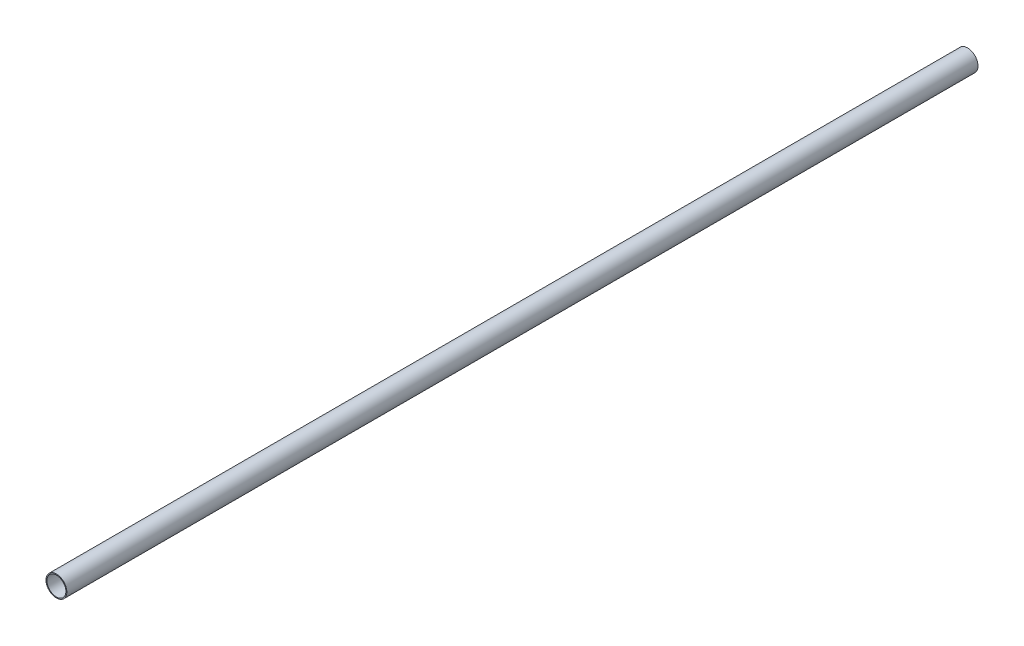
ISO-10303-21;
HEADER;
FILE_DESCRIPTION(('STEP AP214'),'2;1');
FILE_NAME('part.step','',(''),(''),'','','');
FILE_SCHEMA(('AUTOMOTIVE_DESIGN { 1 0 10303 214 1 1 1 1 }'));
ENDSEC;
DATA;
#1=APPLICATION_CONTEXT('core data for automotive mechanical design processes');
#2=APPLICATION_PROTOCOL_DEFINITION('international standard','automotive_design',2000,#1);
#3=PRODUCT_CONTEXT('',#1,'mechanical');
#4=PRODUCT('Part','Part','',(#3));
#5=PRODUCT_RELATED_PRODUCT_CATEGORY('part','',(#4));
#6=PRODUCT_DEFINITION_FORMATION('','',#4);
#7=PRODUCT_DEFINITION_CONTEXT('part definition',#1,'design');
#8=PRODUCT_DEFINITION('design','',#6,#7);
#9=PRODUCT_DEFINITION_SHAPE('','',#8);
#10=(LENGTH_UNIT() NAMED_UNIT(*) SI_UNIT(.MILLI.,.METRE.));
#11=(NAMED_UNIT(*) PLANE_ANGLE_UNIT() SI_UNIT($,.RADIAN.));
#12=(NAMED_UNIT(*) SI_UNIT($,.STERADIAN.) SOLID_ANGLE_UNIT());
#13=UNCERTAINTY_MEASURE_WITH_UNIT(LENGTH_MEASURE(1.E-05),#10,'distance_accuracy_value','');
#14=(GEOMETRIC_REPRESENTATION_CONTEXT(3) GLOBAL_UNCERTAINTY_ASSIGNED_CONTEXT((#13)) GLOBAL_UNIT_ASSIGNED_CONTEXT((#10,
#11,#12)) REPRESENTATION_CONTEXT('',''));
#15=CARTESIAN_POINT('',(0.,0.,0.));
#16=DIRECTION('',(0.,0.,1.));
#17=DIRECTION('',(1.,0.,0.));
#18=AXIS2_PLACEMENT_3D('',#15,#16,#17);
#19=CARTESIAN_POINT('',(0.,0.,961.));
#20=DIRECTION('',(0.,0.,1.));
#21=DIRECTION('',(1.,0.,0.));
#22=AXIS2_PLACEMENT_3D('',#19,#20,#21);
#23=PLANE('',#22);
#24=CARTESIAN_POINT('',(0.,0.,961.));
#25=DIRECTION('',(0.,0.,1.));
#26=DIRECTION('',(1.,0.,0.));
#27=AXIS2_PLACEMENT_3D('',#24,#25,#26);
#28=CIRCLE('',#27,11.);
#29=CARTESIAN_POINT('',(11.,0.,961.));
#30=VERTEX_POINT('',#29);
#31=EDGE_CURVE('E10',#30,#30,#28,.T.);
#32=ORIENTED_EDGE('',*,*,#31,.T.);
#33=EDGE_LOOP('',(#32));
#34=FACE_BOUND('',#33,.T.);
#35=CARTESIAN_POINT('',(0.,0.,961.));
#36=DIRECTION('',(0.,0.,1.));
#37=DIRECTION('',(1.,0.,0.));
#38=AXIS2_PLACEMENT_3D('',#35,#36,#37);
#39=CIRCLE('',#38,10.);
#40=CARTESIAN_POINT('',(10.,0.,961.));
#41=VERTEX_POINT('',#40);
#42=EDGE_CURVE('E50',#41,#41,#39,.T.);
#43=ORIENTED_EDGE('',*,*,#42,.F.);
#44=EDGE_LOOP('',(#43));
#45=FACE_BOUND('',#44,.T.);
#46=ADVANCED_FACE('F39',(#34,#45),#23,.T.);
#47=CARTESIAN_POINT('',(0.,0.,0.));
#48=DIRECTION('',(0.,0.,1.));
#49=DIRECTION('',(1.,0.,0.));
#50=AXIS2_PLACEMENT_3D('',#47,#48,#49);
#51=PLANE('',#50);
#52=CARTESIAN_POINT('',(0.,0.,0.));
#53=DIRECTION('',(0.,0.,1.));
#54=DIRECTION('',(1.,0.,0.));
#55=AXIS2_PLACEMENT_3D('',#52,#53,#54);
#56=CIRCLE('',#55,11.);
#57=CARTESIAN_POINT('',(11.,0.,0.));
#58=VERTEX_POINT('',#57);
#59=EDGE_CURVE('E43',#58,#58,#56,.T.);
#60=ORIENTED_EDGE('',*,*,#59,.F.);
#61=EDGE_LOOP('',(#60));
#62=FACE_BOUND('',#61,.T.);
#63=CARTESIAN_POINT('',(0.,0.,0.));
#64=DIRECTION('',(0.,0.,1.));
#65=DIRECTION('',(1.,0.,0.));
#66=AXIS2_PLACEMENT_3D('',#63,#64,#65);
#67=CIRCLE('',#66,10.);
#68=CARTESIAN_POINT('',(10.,0.,0.));
#69=VERTEX_POINT('',#68);
#70=EDGE_CURVE('E52',#69,#69,#67,.T.);
#71=ORIENTED_EDGE('',*,*,#70,.T.);
#72=EDGE_LOOP('',(#71));
#73=FACE_BOUND('',#72,.T.);
#74=ADVANCED_FACE('F62',(#62,#73),#51,.F.);
#75=CARTESIAN_POINT('',(0.,0.,961.));
#76=DIRECTION('',(0.,0.,-1.));
#77=DIRECTION('',(-1.,0.,0.));
#78=AXIS2_PLACEMENT_3D('',#75,#76,#77);
#79=CYLINDRICAL_SURFACE('',#78,11.);
#80=ORIENTED_EDGE('',*,*,#31,.F.);
#81=EDGE_LOOP('',(#80));
#82=FACE_BOUND('',#81,.T.);
#83=ORIENTED_EDGE('',*,*,#59,.T.);
#84=EDGE_LOOP('',(#83));
#85=FACE_BOUND('',#84,.T.);
#86=ADVANCED_FACE('F41',(#82,#85),#79,.T.);
#87=CARTESIAN_POINT('',(0.,0.,961.));
#88=DIRECTION('',(0.,0.,-1.));
#89=DIRECTION('',(-1.,0.,0.));
#90=AXIS2_PLACEMENT_3D('',#87,#88,#89);
#91=CYLINDRICAL_SURFACE('',#90,10.);
#92=ORIENTED_EDGE('',*,*,#42,.T.);
#93=EDGE_LOOP('',(#92));
#94=FACE_BOUND('',#93,.T.);
#95=ORIENTED_EDGE('',*,*,#70,.F.);
#96=EDGE_LOOP('',(#95));
#97=FACE_BOUND('',#96,.T.);
#98=ADVANCED_FACE('F58',(#94,#97),#91,.F.);
#99=CLOSED_SHELL('',(#46,#74,#86,#98));
#100=MANIFOLD_SOLID_BREP('B2',#99);
#101=ADVANCED_BREP_SHAPE_REPRESENTATION('',(#18,#100),#14);
#102=SHAPE_DEFINITION_REPRESENTATION(#9,#101);
ENDSEC;
END-ISO-10303-21;
